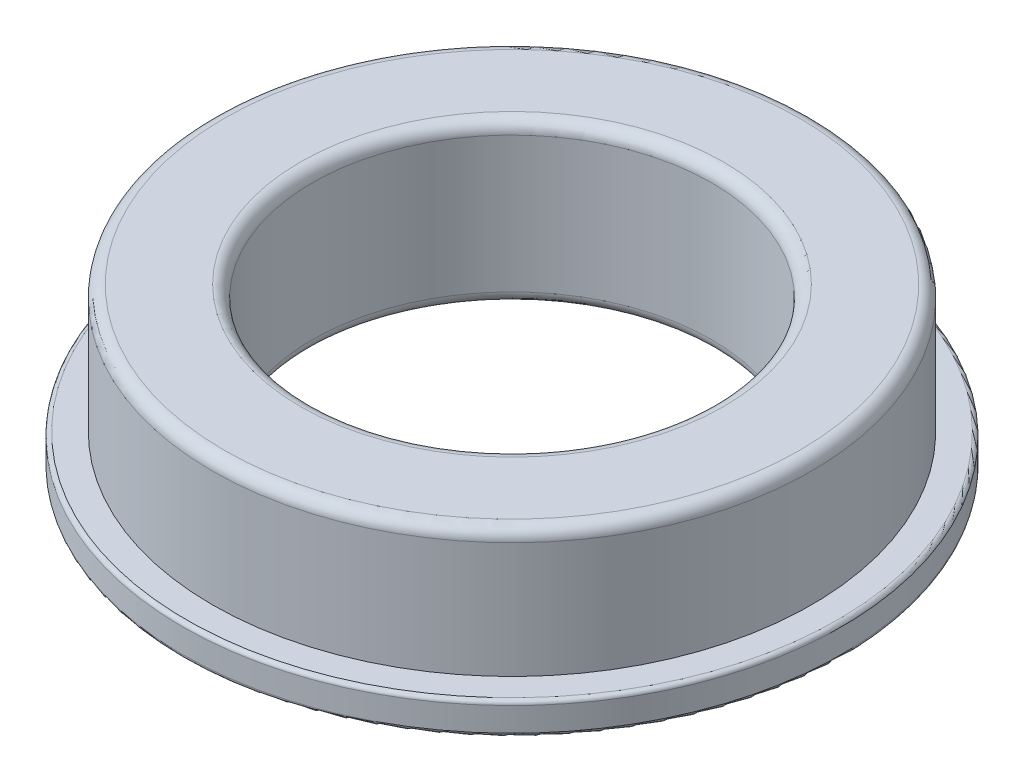
ISO-10303-21;
HEADER;
FILE_DESCRIPTION(('STEP AP214'),'2;1');
FILE_NAME('part.step','',(''),(''),'','','');
FILE_SCHEMA(('AUTOMOTIVE_DESIGN { 1 0 10303 214 1 1 1 1 }'));
ENDSEC;
DATA;
#1=APPLICATION_CONTEXT('core data for automotive mechanical design processes');
#2=APPLICATION_PROTOCOL_DEFINITION('international standard','automotive_design',2000,#1);
#3=PRODUCT_CONTEXT('',#1,'mechanical');
#4=PRODUCT('Part','Part','',(#3));
#5=PRODUCT_RELATED_PRODUCT_CATEGORY('part','',(#4));
#6=PRODUCT_DEFINITION_FORMATION('','',#4);
#7=PRODUCT_DEFINITION_CONTEXT('part definition',#1,'design');
#8=PRODUCT_DEFINITION('design','',#6,#7);
#9=PRODUCT_DEFINITION_SHAPE('','',#8);
#10=(LENGTH_UNIT() NAMED_UNIT(*) SI_UNIT(.MILLI.,.METRE.));
#11=(NAMED_UNIT(*) PLANE_ANGLE_UNIT() SI_UNIT($,.RADIAN.));
#12=(NAMED_UNIT(*) SI_UNIT($,.STERADIAN.) SOLID_ANGLE_UNIT());
#13=UNCERTAINTY_MEASURE_WITH_UNIT(LENGTH_MEASURE(1.E-05),#10,'distance_accuracy_value','');
#14=(GEOMETRIC_REPRESENTATION_CONTEXT(3) GLOBAL_UNCERTAINTY_ASSIGNED_CONTEXT((#13)) GLOBAL_UNIT_ASSIGNED_CONTEXT((#10,
#11,#12)) REPRESENTATION_CONTEXT('',''));
#15=CARTESIAN_POINT('',(0.,0.,0.));
#16=DIRECTION('',(0.,0.,1.));
#17=DIRECTION('',(1.,0.,0.));
#18=AXIS2_PLACEMENT_3D('',#15,#16,#17);
#19=CARTESIAN_POINT('',(0.,4.,0.));
#20=DIRECTION('',(0.,-1.,0.));
#21=DIRECTION('',(0.,0.,-1.));
#22=AXIS2_PLACEMENT_3D('',#19,#20,#21);
#23=CYLINDRICAL_SURFACE('',#22,7.5);
#24=CARTESIAN_POINT('',(0.,3.7,0.));
#25=DIRECTION('',(0.,1.,0.));
#26=DIRECTION('',(0.,0.,1.));
#27=AXIS2_PLACEMENT_3D('',#24,#25,#26);
#28=CIRCLE('',#27,7.5);
#29=CARTESIAN_POINT('',(0.,3.7,7.5));
#30=VERTEX_POINT('',#29);
#31=EDGE_CURVE('E67',#30,#30,#28,.F.);
#32=ORIENTED_EDGE('',*,*,#31,.T.);
#33=EDGE_LOOP('',(#32));
#34=FACE_BOUND('',#33,.T.);
#35=CARTESIAN_POINT('',(0.,0.8,0.));
#36=DIRECTION('',(0.,-1.,0.));
#37=DIRECTION('',(0.,0.,-1.));
#38=AXIS2_PLACEMENT_3D('',#35,#36,#37);
#39=CIRCLE('',#38,7.5);
#40=CARTESIAN_POINT('',(0.,0.8,-7.5));
#41=VERTEX_POINT('',#40);
#42=EDGE_CURVE('E91',#41,#41,#39,.T.);
#43=ORIENTED_EDGE('',*,*,#42,.F.);
#44=EDGE_LOOP('',(#43));
#45=FACE_BOUND('',#44,.T.);
#46=ADVANCED_FACE('F43',(#34,#45),#23,.T.);
#47=CARTESIAN_POINT('',(0.,4.,0.));
#48=DIRECTION('',(0.,1.,0.));
#49=DIRECTION('',(0.,0.,1.));
#50=AXIS2_PLACEMENT_3D('',#47,#48,#49);
#51=PLANE('',#50);
#52=CARTESIAN_POINT('',(0.,4.,0.));
#53=DIRECTION('',(0.,1.,0.));
#54=DIRECTION('',(0.,0.,1.));
#55=AXIS2_PLACEMENT_3D('',#52,#53,#54);
#56=CIRCLE('',#55,5.3);
#57=CARTESIAN_POINT('',(0.,4.,5.3));
#58=VERTEX_POINT('',#57);
#59=EDGE_CURVE('E75',#58,#58,#56,.F.);
#60=ORIENTED_EDGE('',*,*,#59,.T.);
#61=EDGE_LOOP('',(#60));
#62=FACE_BOUND('',#61,.T.);
#63=CARTESIAN_POINT('',(0.,4.,0.));
#64=DIRECTION('',(0.,1.,0.));
#65=DIRECTION('',(0.,0.,1.));
#66=AXIS2_PLACEMENT_3D('',#63,#64,#65);
#67=CIRCLE('',#66,7.2);
#68=CARTESIAN_POINT('',(0.,4.,7.2));
#69=VERTEX_POINT('',#68);
#70=EDGE_CURVE('E79',#69,#69,#67,.T.);
#71=ORIENTED_EDGE('',*,*,#70,.T.);
#72=EDGE_LOOP('',(#71));
#73=FACE_BOUND('',#72,.T.);
#74=ADVANCED_FACE('F99',(#62,#73),#51,.T.);
#75=CARTESIAN_POINT('',(0.,0.,0.));
#76=DIRECTION('',(0.,1.,0.));
#77=DIRECTION('',(0.,0.,1.));
#78=AXIS2_PLACEMENT_3D('',#75,#76,#77);
#79=PLANE('',#78);
#80=CARTESIAN_POINT('',(0.,0.,0.));
#81=DIRECTION('',(0.,1.,0.));
#82=DIRECTION('',(0.,0.,1.));
#83=AXIS2_PLACEMENT_3D('',#80,#81,#82);
#84=CIRCLE('',#83,8.15);
#85=CARTESIAN_POINT('',(0.,0.,8.15));
#86=VERTEX_POINT('',#85);
#87=EDGE_CURVE('E10',#86,#86,#84,.F.);
#88=ORIENTED_EDGE('',*,*,#87,.T.);
#89=EDGE_LOOP('',(#88));
#90=FACE_BOUND('',#89,.T.);
#91=CARTESIAN_POINT('',(0.,0.,0.));
#92=DIRECTION('',(0.,1.,0.));
#93=DIRECTION('',(0.,0.,1.));
#94=AXIS2_PLACEMENT_3D('',#91,#92,#93);
#95=CIRCLE('',#94,5.3);
#96=CARTESIAN_POINT('',(0.,0.,5.3));
#97=VERTEX_POINT('',#96);
#98=EDGE_CURVE('E71',#97,#97,#95,.T.);
#99=ORIENTED_EDGE('',*,*,#98,.T.);
#100=EDGE_LOOP('',(#99));
#101=FACE_BOUND('',#100,.T.);
#102=ADVANCED_FACE('F105',(#90,#101),#79,.F.);
#103=CARTESIAN_POINT('',(0.,4.,0.));
#104=DIRECTION('',(0.,-1.,0.));
#105=DIRECTION('',(0.,0.,-1.));
#106=AXIS2_PLACEMENT_3D('',#103,#104,#105);
#107=CYLINDRICAL_SURFACE('',#106,5.);
#108=CARTESIAN_POINT('',(0.,3.7,0.));
#109=DIRECTION('',(0.,1.,0.));
#110=DIRECTION('',(0.,0.,1.));
#111=AXIS2_PLACEMENT_3D('',#108,#109,#110);
#112=CIRCLE('',#111,5.);
#113=CARTESIAN_POINT('',(0.,3.7,5.));
#114=VERTEX_POINT('',#113);
#115=EDGE_CURVE('E83',#114,#114,#112,.T.);
#116=ORIENTED_EDGE('',*,*,#115,.T.);
#117=EDGE_LOOP('',(#116));
#118=FACE_BOUND('',#117,.T.);
#119=CARTESIAN_POINT('',(0.,0.3,0.));
#120=DIRECTION('',(0.,1.,0.));
#121=DIRECTION('',(0.,0.,1.));
#122=AXIS2_PLACEMENT_3D('',#119,#120,#121);
#123=CIRCLE('',#122,5.);
#124=CARTESIAN_POINT('',(0.,0.3,5.));
#125=VERTEX_POINT('',#124);
#126=EDGE_CURVE('E87',#125,#125,#123,.F.);
#127=ORIENTED_EDGE('',*,*,#126,.T.);
#128=EDGE_LOOP('',(#127));
#129=FACE_BOUND('',#128,.T.);
#130=ADVANCED_FACE('F140',(#118,#129),#107,.F.);
#131=CARTESIAN_POINT('',(0.,0.8,0.));
#132=DIRECTION('',(0.,-1.,0.));
#133=DIRECTION('',(0.,0.,-1.));
#134=AXIS2_PLACEMENT_3D('',#131,#132,#133);
#135=PLANE('',#134);
#136=CARTESIAN_POINT('',(0.,0.8,0.));
#137=DIRECTION('',(0.,-1.,0.));
#138=DIRECTION('',(0.,0.,-1.));
#139=AXIS2_PLACEMENT_3D('',#136,#137,#138);
#140=CIRCLE('',#139,8.15);
#141=CARTESIAN_POINT('',(0.,0.8,-8.15));
#142=VERTEX_POINT('',#141);
#143=EDGE_CURVE('E51',#142,#142,#140,.F.);
#144=ORIENTED_EDGE('',*,*,#143,.T.);
#145=EDGE_LOOP('',(#144));
#146=FACE_BOUND('',#145,.T.);
#147=ORIENTED_EDGE('',*,*,#42,.T.);
#148=EDGE_LOOP('',(#147));
#149=FACE_BOUND('',#148,.T.);
#150=ADVANCED_FACE('F96',(#146,#149),#135,.F.);
#151=CARTESIAN_POINT('',(0.,0.8,0.));
#152=DIRECTION('',(0.,-1.,0.));
#153=DIRECTION('',(0.,0.,-1.));
#154=AXIS2_PLACEMENT_3D('',#151,#152,#153);
#155=CYLINDRICAL_SURFACE('',#154,8.25);
#156=CARTESIAN_POINT('',(0.,0.7,0.));
#157=DIRECTION('',(0.,-1.,0.));
#158=DIRECTION('',(0.,0.,-1.));
#159=AXIS2_PLACEMENT_3D('',#156,#157,#158);
#160=CIRCLE('',#159,8.25);
#161=CARTESIAN_POINT('',(0.,0.7,-8.25));
#162=VERTEX_POINT('',#161);
#163=EDGE_CURVE('E56',#162,#162,#160,.T.);
#164=ORIENTED_EDGE('',*,*,#163,.T.);
#165=EDGE_LOOP('',(#164));
#166=FACE_BOUND('',#165,.T.);
#167=CARTESIAN_POINT('',(0.,0.1,0.));
#168=DIRECTION('',(0.,1.,0.));
#169=DIRECTION('',(0.,0.,1.));
#170=AXIS2_PLACEMENT_3D('',#167,#168,#169);
#171=CIRCLE('',#170,8.25);
#172=CARTESIAN_POINT('',(0.,0.1,8.25));
#173=VERTEX_POINT('',#172);
#174=EDGE_CURVE('E61',#173,#173,#171,.T.);
#175=ORIENTED_EDGE('',*,*,#174,.T.);
#176=EDGE_LOOP('',(#175));
#177=FACE_BOUND('',#176,.T.);
#178=ADVANCED_FACE('F114',(#166,#177),#155,.T.);
#179=CARTESIAN_POINT('',(0.,3.7,0.));
#180=DIRECTION('',(0.,1.,0.));
#181=DIRECTION('',(0.,0.,1.));
#182=AXIS2_PLACEMENT_3D('',#179,#180,#181);
#183=TOROIDAL_SURFACE('',#182,5.3,0.3);
#184=ORIENTED_EDGE('',*,*,#59,.F.);
#185=EDGE_LOOP('',(#184));
#186=FACE_BOUND('',#185,.T.);
#187=ORIENTED_EDGE('',*,*,#115,.F.);
#188=EDGE_LOOP('',(#187));
#189=FACE_BOUND('',#188,.T.);
#190=ADVANCED_FACE('F110',(#186,#189),#183,.T.);
#191=CARTESIAN_POINT('',(0.,0.3,0.));
#192=DIRECTION('',(0.,1.,0.));
#193=DIRECTION('',(0.,0.,1.));
#194=AXIS2_PLACEMENT_3D('',#191,#192,#193);
#195=TOROIDAL_SURFACE('',#194,5.3,0.3);
#196=ORIENTED_EDGE('',*,*,#126,.F.);
#197=EDGE_LOOP('',(#196));
#198=FACE_BOUND('',#197,.T.);
#199=ORIENTED_EDGE('',*,*,#98,.F.);
#200=EDGE_LOOP('',(#199));
#201=FACE_BOUND('',#200,.T.);
#202=ADVANCED_FACE('F113',(#198,#201),#195,.T.);
#203=CARTESIAN_POINT('',(0.,3.7,0.));
#204=DIRECTION('',(0.,1.,0.));
#205=DIRECTION('',(0.,0.,1.));
#206=AXIS2_PLACEMENT_3D('',#203,#204,#205);
#207=TOROIDAL_SURFACE('',#206,7.2,0.3);
#208=ORIENTED_EDGE('',*,*,#31,.F.);
#209=EDGE_LOOP('',(#208));
#210=FACE_BOUND('',#209,.T.);
#211=ORIENTED_EDGE('',*,*,#70,.F.);
#212=EDGE_LOOP('',(#211));
#213=FACE_BOUND('',#212,.T.);
#214=ADVANCED_FACE('F118',(#210,#213),#207,.T.);
#215=CARTESIAN_POINT('',(0.,0.7,0.));
#216=DIRECTION('',(0.,-1.,0.));
#217=DIRECTION('',(0.,0.,-1.));
#218=AXIS2_PLACEMENT_3D('',#215,#216,#217);
#219=TOROIDAL_SURFACE('',#218,8.15,0.1);
#220=ORIENTED_EDGE('',*,*,#143,.F.);
#221=EDGE_LOOP('',(#220));
#222=FACE_BOUND('',#221,.T.);
#223=ORIENTED_EDGE('',*,*,#163,.F.);
#224=EDGE_LOOP('',(#223));
#225=FACE_BOUND('',#224,.T.);
#226=ADVANCED_FACE('F121',(#222,#225),#219,.T.);
#227=CARTESIAN_POINT('',(0.,0.1,0.));
#228=DIRECTION('',(0.,1.,0.));
#229=DIRECTION('',(0.,0.,1.));
#230=AXIS2_PLACEMENT_3D('',#227,#228,#229);
#231=TOROIDAL_SURFACE('',#230,8.15,0.1);
#232=ORIENTED_EDGE('',*,*,#174,.F.);
#233=EDGE_LOOP('',(#232));
#234=FACE_BOUND('',#233,.T.);
#235=ORIENTED_EDGE('',*,*,#87,.F.);
#236=EDGE_LOOP('',(#235));
#237=FACE_BOUND('',#236,.T.);
#238=ADVANCED_FACE('F45',(#234,#237),#231,.T.);
#239=CLOSED_SHELL('',(#46,#74,#102,#130,#150,#178,#190,#202,#214,#226,#238));
#240=MANIFOLD_SOLID_BREP('B2',#239);
#241=ADVANCED_BREP_SHAPE_REPRESENTATION('',(#18,#240),#14);
#242=SHAPE_DEFINITION_REPRESENTATION(#9,#241);
ENDSEC;
END-ISO-10303-21;
